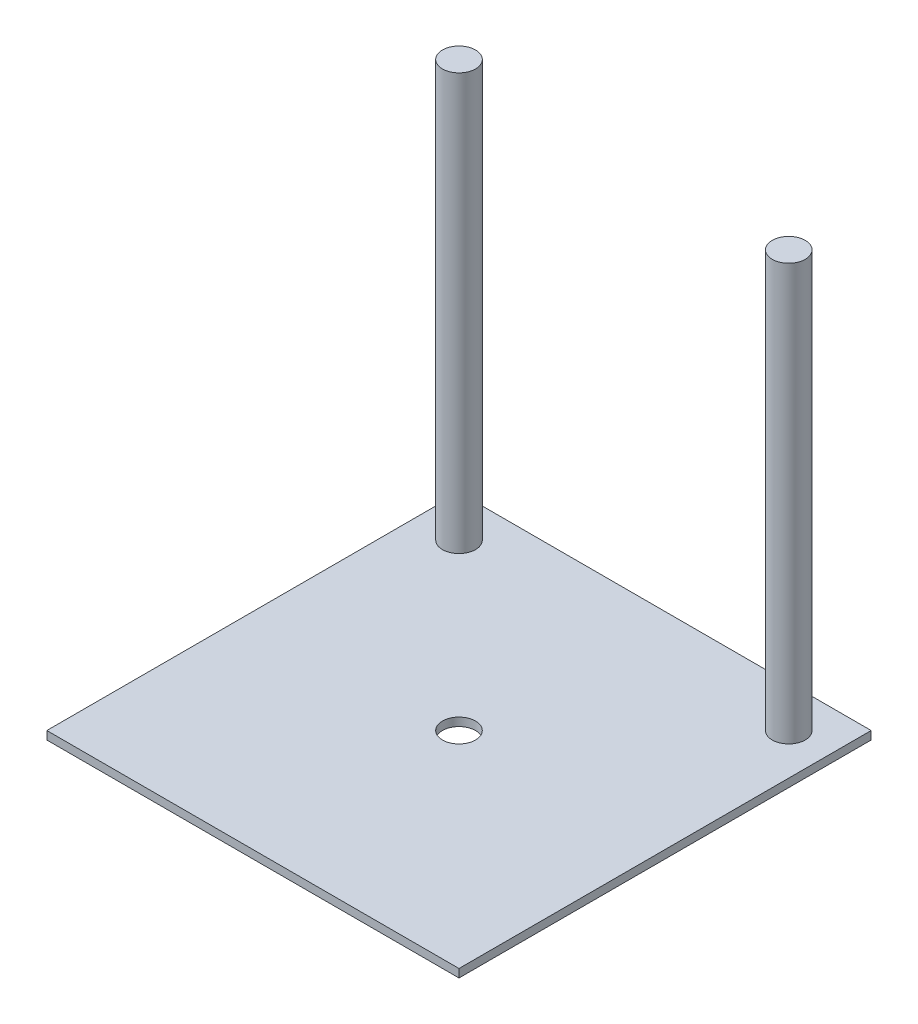
ISO-10303-21;
HEADER;
FILE_DESCRIPTION(('STEP AP214'),'2;1');
FILE_NAME('part.step','',(''),(''),'','','');
FILE_SCHEMA(('AUTOMOTIVE_DESIGN { 1 0 10303 214 1 1 1 1 }'));
ENDSEC;
DATA;
#1=APPLICATION_CONTEXT('core data for automotive mechanical design processes');
#2=APPLICATION_PROTOCOL_DEFINITION('international standard','automotive_design',2000,#1);
#3=PRODUCT_CONTEXT('',#1,'mechanical');
#4=PRODUCT('Part','Part','',(#3));
#5=PRODUCT_RELATED_PRODUCT_CATEGORY('part','',(#4));
#6=PRODUCT_DEFINITION_FORMATION('','',#4);
#7=PRODUCT_DEFINITION_CONTEXT('part definition',#1,'design');
#8=PRODUCT_DEFINITION('design','',#6,#7);
#9=PRODUCT_DEFINITION_SHAPE('','',#8);
#10=(LENGTH_UNIT() NAMED_UNIT(*) SI_UNIT(.MILLI.,.METRE.));
#11=(NAMED_UNIT(*) PLANE_ANGLE_UNIT() SI_UNIT($,.RADIAN.));
#12=(NAMED_UNIT(*) SI_UNIT($,.STERADIAN.) SOLID_ANGLE_UNIT());
#13=UNCERTAINTY_MEASURE_WITH_UNIT(LENGTH_MEASURE(1.E-05),#10,'distance_accuracy_value','');
#14=(GEOMETRIC_REPRESENTATION_CONTEXT(3) GLOBAL_UNCERTAINTY_ASSIGNED_CONTEXT((#13)) GLOBAL_UNIT_ASSIGNED_CONTEXT((#10,
#11,#12)) REPRESENTATION_CONTEXT('',''));
#15=CARTESIAN_POINT('',(0.,0.,0.));
#16=DIRECTION('',(0.,0.,1.));
#17=DIRECTION('',(1.,0.,0.));
#18=AXIS2_PLACEMENT_3D('',#15,#16,#17);
#19=CARTESIAN_POINT('',(5.,71.,-45.));
#20=DIRECTION('',(0.,-1.,0.));
#21=DIRECTION('',(0.,0.,-1.));
#22=AXIS2_PLACEMENT_3D('',#19,#20,#21);
#23=CYLINDRICAL_SURFACE('',#22,2.);
#24=CARTESIAN_POINT('',(5.,1.,-45.));
#25=DIRECTION('',(0.,-1.,0.));
#26=DIRECTION('',(0.,0.,-1.));
#27=AXIS2_PLACEMENT_3D('',#24,#25,#26);
#28=CIRCLE('',#27,2.);
#29=CARTESIAN_POINT('',(5.,1.,-47.));
#30=VERTEX_POINT('',#29);
#31=EDGE_CURVE('E48',#30,#30,#28,.F.);
#32=ORIENTED_EDGE('',*,*,#31,.T.);
#33=EDGE_LOOP('',(#32));
#34=FACE_BOUND('',#33,.T.);
#35=CARTESIAN_POINT('',(5.,51.5,-45.));
#36=DIRECTION('',(0.,1.,0.));
#37=DIRECTION('',(0.,0.,1.));
#38=AXIS2_PLACEMENT_3D('',#35,#36,#37);
#39=CIRCLE('',#38,2.);
#40=CARTESIAN_POINT('',(5.,51.5,-43.));
#41=VERTEX_POINT('',#40);
#42=EDGE_CURVE('E175',#41,#41,#39,.T.);
#43=ORIENTED_EDGE('',*,*,#42,.F.);
#44=EDGE_LOOP('',(#43));
#45=FACE_BOUND('',#44,.T.);
#46=ADVANCED_FACE('F38',(#34,#45),#23,.T.);
#47=CARTESIAN_POINT('',(45.,71.,-45.));
#48=DIRECTION('',(0.,-1.,0.));
#49=DIRECTION('',(0.,0.,-1.));
#50=AXIS2_PLACEMENT_3D('',#47,#48,#49);
#51=CYLINDRICAL_SURFACE('',#50,2.);
#52=CARTESIAN_POINT('',(45.,1.,-45.));
#53=DIRECTION('',(0.,-1.,0.));
#54=DIRECTION('',(0.,0.,-1.));
#55=AXIS2_PLACEMENT_3D('',#52,#53,#54);
#56=CIRCLE('',#55,2.);
#57=CARTESIAN_POINT('',(45.,1.,-47.));
#58=VERTEX_POINT('',#57);
#59=EDGE_CURVE('E11',#58,#58,#56,.F.);
#60=ORIENTED_EDGE('',*,*,#59,.T.);
#61=EDGE_LOOP('',(#60));
#62=FACE_BOUND('',#61,.T.);
#63=CARTESIAN_POINT('',(45.,51.5,-45.));
#64=DIRECTION('',(0.,1.,0.));
#65=DIRECTION('',(0.,0.,1.));
#66=AXIS2_PLACEMENT_3D('',#63,#64,#65);
#67=CIRCLE('',#66,2.);
#68=CARTESIAN_POINT('',(45.,51.5,-43.));
#69=VERTEX_POINT('',#68);
#70=EDGE_CURVE('E181',#69,#69,#67,.T.);
#71=ORIENTED_EDGE('',*,*,#70,.F.);
#72=EDGE_LOOP('',(#71));
#73=FACE_BOUND('',#72,.T.);
#74=ADVANCED_FACE('F136',(#62,#73),#51,.T.);
#75=CARTESIAN_POINT('',(0.,1.,0.));
#76=DIRECTION('',(0.,-1.,0.));
#77=DIRECTION('',(0.,0.,-1.));
#78=AXIS2_PLACEMENT_3D('',#75,#76,#77);
#79=PLANE('',#78);
#80=ORIENTED_EDGE('',*,*,#59,.F.);
#81=EDGE_LOOP('',(#80));
#82=FACE_BOUND('',#81,.T.);
#83=ORIENTED_EDGE('',*,*,#31,.F.);
#84=EDGE_LOOP('',(#83));
#85=FACE_BOUND('',#84,.T.);
#86=DIRECTION('',(0.,0.,1.));
#87=VECTOR('',#86,1.);
#88=CARTESIAN_POINT('',(0.,1.,0.));
#89=LINE('',#88,#87);
#90=CARTESIAN_POINT('',(0.,1.,-50.));
#91=VERTEX_POINT('',#90);
#92=CARTESIAN_POINT('',(0.,1.,0.));
#93=VERTEX_POINT('',#92);
#94=EDGE_CURVE('E93',#91,#93,#89,.T.);
#95=ORIENTED_EDGE('',*,*,#94,.T.);
#96=DIRECTION('',(1.,0.,0.));
#97=VECTOR('',#96,1.);
#98=CARTESIAN_POINT('',(0.,1.,0.));
#99=LINE('',#98,#97);
#100=CARTESIAN_POINT('',(50.,1.,0.));
#101=VERTEX_POINT('',#100);
#102=EDGE_CURVE('E87',#93,#101,#99,.T.);
#103=ORIENTED_EDGE('',*,*,#102,.T.);
#104=DIRECTION('',(0.,0.,-1.));
#105=VECTOR('',#104,1.);
#106=CARTESIAN_POINT('',(50.,1.,0.));
#107=LINE('',#106,#105);
#108=CARTESIAN_POINT('',(50.,1.,-50.));
#109=VERTEX_POINT('',#108);
#110=EDGE_CURVE('E91',#101,#109,#107,.T.);
#111=ORIENTED_EDGE('',*,*,#110,.T.);
#112=DIRECTION('',(-1.,0.,0.));
#113=VECTOR('',#112,1.);
#114=CARTESIAN_POINT('',(0.,1.,-50.));
#115=LINE('',#114,#113);
#116=EDGE_CURVE('E56',#109,#91,#115,.T.);
#117=ORIENTED_EDGE('',*,*,#116,.T.);
#118=EDGE_LOOP('',(#95,#103,#111,#117));
#119=FACE_BOUND('',#118,.T.);
#120=CARTESIAN_POINT('',(25.,1.,-25.));
#121=DIRECTION('',(0.,1.,0.));
#122=DIRECTION('',(0.,0.,1.));
#123=AXIS2_PLACEMENT_3D('',#120,#121,#122);
#124=CIRCLE('',#123,2.);
#125=CARTESIAN_POINT('',(25.,1.,-23.));
#126=VERTEX_POINT('',#125);
#127=EDGE_CURVE('E116',#126,#126,#124,.T.);
#128=ORIENTED_EDGE('',*,*,#127,.F.);
#129=EDGE_LOOP('',(#128));
#130=FACE_BOUND('',#129,.T.);
#131=ADVANCED_FACE('F88',(#82,#85,#119,#130),#79,.F.);
#132=CARTESIAN_POINT('',(0.,0.,0.));
#133=DIRECTION('',(0.,-1.,0.));
#134=DIRECTION('',(0.,0.,-1.));
#135=AXIS2_PLACEMENT_3D('',#132,#133,#134);
#136=PLANE('',#135);
#137=DIRECTION('',(0.,0.,1.));
#138=VECTOR('',#137,1.);
#139=CARTESIAN_POINT('',(0.,0.,0.));
#140=LINE('',#139,#138);
#141=CARTESIAN_POINT('',(0.,0.,-50.));
#142=VERTEX_POINT('',#141);
#143=CARTESIAN_POINT('',(0.,0.,0.));
#144=VERTEX_POINT('',#143);
#145=EDGE_CURVE('E112',#142,#144,#140,.T.);
#146=ORIENTED_EDGE('',*,*,#145,.F.);
#147=DIRECTION('',(-1.,0.,0.));
#148=VECTOR('',#147,1.);
#149=CARTESIAN_POINT('',(0.,0.,-50.));
#150=LINE('',#149,#148);
#151=CARTESIAN_POINT('',(50.,0.,-50.));
#152=VERTEX_POINT('',#151);
#153=EDGE_CURVE('E79',#152,#142,#150,.T.);
#154=ORIENTED_EDGE('',*,*,#153,.F.);
#155=DIRECTION('',(0.,0.,-1.));
#156=VECTOR('',#155,1.);
#157=CARTESIAN_POINT('',(50.,0.,0.));
#158=LINE('',#157,#156);
#159=CARTESIAN_POINT('',(50.,0.,0.));
#160=VERTEX_POINT('',#159);
#161=EDGE_CURVE('E73',#160,#152,#158,.T.);
#162=ORIENTED_EDGE('',*,*,#161,.F.);
#163=DIRECTION('',(1.,0.,0.));
#164=VECTOR('',#163,1.);
#165=CARTESIAN_POINT('',(0.,0.,0.));
#166=LINE('',#165,#164);
#167=EDGE_CURVE('E99',#144,#160,#166,.T.);
#168=ORIENTED_EDGE('',*,*,#167,.F.);
#169=EDGE_LOOP('',(#146,#154,#162,#168));
#170=FACE_BOUND('',#169,.T.);
#171=CARTESIAN_POINT('',(25.,0.,-25.));
#172=DIRECTION('',(0.,1.,0.));
#173=DIRECTION('',(0.,0.,1.));
#174=AXIS2_PLACEMENT_3D('',#171,#172,#173);
#175=CIRCLE('',#174,2.);
#176=CARTESIAN_POINT('',(25.,0.,-23.));
#177=VERTEX_POINT('',#176);
#178=EDGE_CURVE('E172',#177,#177,#175,.T.);
#179=ORIENTED_EDGE('',*,*,#178,.T.);
#180=EDGE_LOOP('',(#179));
#181=FACE_BOUND('',#180,.T.);
#182=ADVANCED_FACE('F135',(#170,#181),#136,.T.);
#183=CARTESIAN_POINT('',(0.,1.,0.));
#184=DIRECTION('',(1.,0.,0.));
#185=DIRECTION('',(0.,0.,-1.));
#186=AXIS2_PLACEMENT_3D('',#183,#184,#185);
#187=PLANE('',#186);
#188=ORIENTED_EDGE('',*,*,#145,.T.);
#189=DIRECTION('',(0.,-1.,0.));
#190=VECTOR('',#189,1.);
#191=CARTESIAN_POINT('',(0.,1.,0.));
#192=LINE('',#191,#190);
#193=EDGE_CURVE('E101',#93,#144,#192,.T.);
#194=ORIENTED_EDGE('',*,*,#193,.F.);
#195=ORIENTED_EDGE('',*,*,#94,.F.);
#196=DIRECTION('',(0.,-1.,0.));
#197=VECTOR('',#196,1.);
#198=CARTESIAN_POINT('',(0.,1.,-50.));
#199=LINE('',#198,#197);
#200=EDGE_CURVE('E108',#91,#142,#199,.T.);
#201=ORIENTED_EDGE('',*,*,#200,.T.);
#202=EDGE_LOOP('',(#188,#194,#195,#201));
#203=FACE_BOUND('',#202,.T.);
#204=ADVANCED_FACE('F40',(#203),#187,.F.);
#205=CARTESIAN_POINT('',(0.,1.,0.));
#206=DIRECTION('',(0.,0.,-1.));
#207=DIRECTION('',(-1.,0.,0.));
#208=AXIS2_PLACEMENT_3D('',#205,#206,#207);
#209=PLANE('',#208);
#210=ORIENTED_EDGE('',*,*,#167,.T.);
#211=DIRECTION('',(0.,-1.,0.));
#212=VECTOR('',#211,1.);
#213=CARTESIAN_POINT('',(50.,1.,0.));
#214=LINE('',#213,#212);
#215=EDGE_CURVE('E97',#101,#160,#214,.T.);
#216=ORIENTED_EDGE('',*,*,#215,.F.);
#217=ORIENTED_EDGE('',*,*,#102,.F.);
#218=ORIENTED_EDGE('',*,*,#193,.T.);
#219=EDGE_LOOP('',(#210,#216,#217,#218));
#220=FACE_BOUND('',#219,.T.);
#221=ADVANCED_FACE('F98',(#220),#209,.F.);
#222=CARTESIAN_POINT('',(50.,1.,0.));
#223=DIRECTION('',(-1.,0.,0.));
#224=DIRECTION('',(0.,0.,1.));
#225=AXIS2_PLACEMENT_3D('',#222,#223,#224);
#226=PLANE('',#225);
#227=ORIENTED_EDGE('',*,*,#161,.T.);
#228=DIRECTION('',(0.,-1.,0.));
#229=VECTOR('',#228,1.);
#230=CARTESIAN_POINT('',(50.,1.,-50.));
#231=LINE('',#230,#229);
#232=EDGE_CURVE('E102',#109,#152,#231,.T.);
#233=ORIENTED_EDGE('',*,*,#232,.F.);
#234=ORIENTED_EDGE('',*,*,#110,.F.);
#235=ORIENTED_EDGE('',*,*,#215,.T.);
#236=EDGE_LOOP('',(#227,#233,#234,#235));
#237=FACE_BOUND('',#236,.T.);
#238=ADVANCED_FACE('F104',(#237),#226,.F.);
#239=CARTESIAN_POINT('',(0.,1.,-50.));
#240=DIRECTION('',(0.,0.,1.));
#241=DIRECTION('',(1.,0.,0.));
#242=AXIS2_PLACEMENT_3D('',#239,#240,#241);
#243=PLANE('',#242);
#244=ORIENTED_EDGE('',*,*,#153,.T.);
#245=ORIENTED_EDGE('',*,*,#200,.F.);
#246=ORIENTED_EDGE('',*,*,#116,.F.);
#247=ORIENTED_EDGE('',*,*,#232,.T.);
#248=EDGE_LOOP('',(#244,#245,#246,#247));
#249=FACE_BOUND('',#248,.T.);
#250=ADVANCED_FACE('F157',(#249),#243,.F.);
#251=CARTESIAN_POINT('',(25.,1.,-25.));
#252=DIRECTION('',(0.,-1.,0.));
#253=DIRECTION('',(0.,0.,-1.));
#254=AXIS2_PLACEMENT_3D('',#251,#252,#253);
#255=CYLINDRICAL_SURFACE('',#254,2.);
#256=ORIENTED_EDGE('',*,*,#127,.T.);
#257=EDGE_LOOP('',(#256));
#258=FACE_BOUND('',#257,.T.);
#259=ORIENTED_EDGE('',*,*,#178,.F.);
#260=EDGE_LOOP('',(#259));
#261=FACE_BOUND('',#260,.T.);
#262=ADVANCED_FACE('F154',(#258,#261),#255,.F.);
#263=CARTESIAN_POINT('',(45.,51.5,-45.));
#264=DIRECTION('',(0.,1.,0.));
#265=DIRECTION('',(0.,0.,1.));
#266=AXIS2_PLACEMENT_3D('',#263,#264,#265);
#267=PLANE('',#266);
#268=ORIENTED_EDGE('',*,*,#70,.T.);
#269=EDGE_LOOP('',(#268));
#270=FACE_BOUND('',#269,.T.);
#271=ADVANCED_FACE('F156',(#270),#267,.T.);
#272=CARTESIAN_POINT('',(5.,51.5,-45.));
#273=DIRECTION('',(0.,1.,0.));
#274=DIRECTION('',(0.,0.,1.));
#275=AXIS2_PLACEMENT_3D('',#272,#273,#274);
#276=PLANE('',#275);
#277=ORIENTED_EDGE('',*,*,#42,.T.);
#278=EDGE_LOOP('',(#277));
#279=FACE_BOUND('',#278,.T.);
#280=ADVANCED_FACE('F164',(#279),#276,.T.);
#281=CLOSED_SHELL('',(#46,#74,#131,#182,#204,#221,#238,#250,#262,#271,#280));
#282=MANIFOLD_SOLID_BREP('B2',#281);
#283=ADVANCED_BREP_SHAPE_REPRESENTATION('',(#18,#282),#14);
#284=SHAPE_DEFINITION_REPRESENTATION(#9,#283);
ENDSEC;
END-ISO-10303-21;
